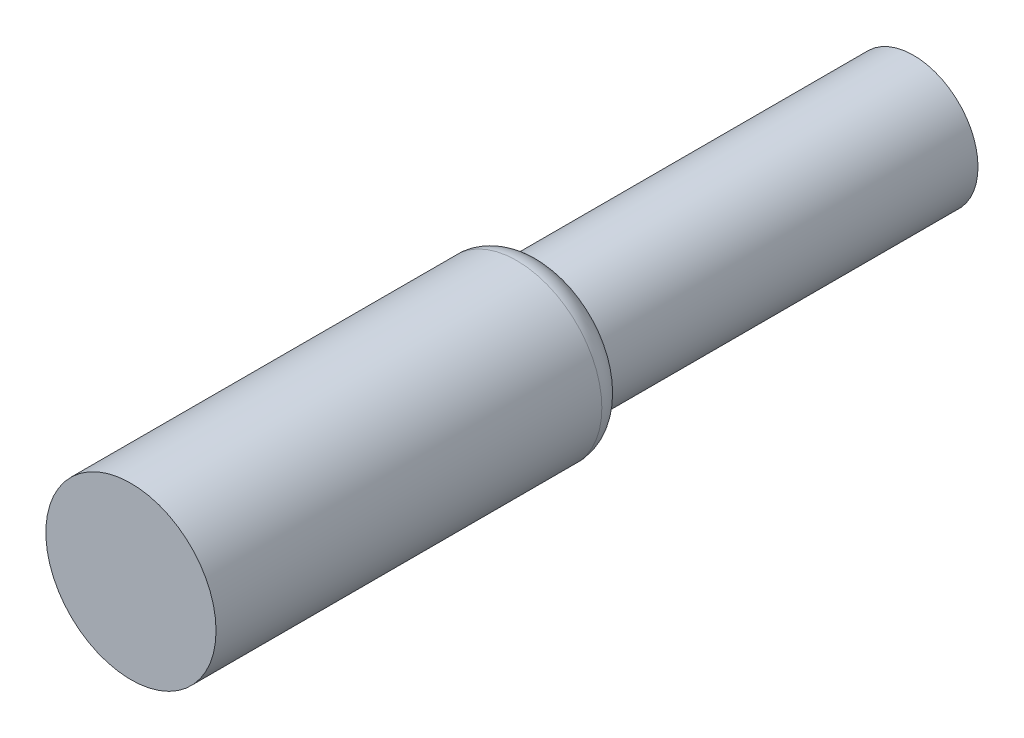
ISO-10303-21;
HEADER;
FILE_DESCRIPTION(('STEP AP214'),'2;1');
FILE_NAME('part.step','',(''),(''),'','','');
FILE_SCHEMA(('AUTOMOTIVE_DESIGN { 1 0 10303 214 1 1 1 1 }'));
ENDSEC;
DATA;
#1=APPLICATION_CONTEXT('core data for automotive mechanical design processes');
#2=APPLICATION_PROTOCOL_DEFINITION('international standard','automotive_design',2000,#1);
#3=PRODUCT_CONTEXT('',#1,'mechanical');
#4=PRODUCT('Part','Part','',(#3));
#5=PRODUCT_RELATED_PRODUCT_CATEGORY('part','',(#4));
#6=PRODUCT_DEFINITION_FORMATION('','',#4);
#7=PRODUCT_DEFINITION_CONTEXT('part definition',#1,'design');
#8=PRODUCT_DEFINITION('design','',#6,#7);
#9=PRODUCT_DEFINITION_SHAPE('','',#8);
#10=(LENGTH_UNIT() NAMED_UNIT(*) SI_UNIT(.MILLI.,.METRE.));
#11=(NAMED_UNIT(*) PLANE_ANGLE_UNIT() SI_UNIT($,.RADIAN.));
#12=(NAMED_UNIT(*) SI_UNIT($,.STERADIAN.) SOLID_ANGLE_UNIT());
#13=UNCERTAINTY_MEASURE_WITH_UNIT(LENGTH_MEASURE(1.E-05),#10,'distance_accuracy_value','');
#14=(GEOMETRIC_REPRESENTATION_CONTEXT(3) GLOBAL_UNCERTAINTY_ASSIGNED_CONTEXT((#13)) GLOBAL_UNIT_ASSIGNED_CONTEXT((#10,
#11,#12)) REPRESENTATION_CONTEXT('',''));
#15=CARTESIAN_POINT('',(0.,0.,0.));
#16=DIRECTION('',(0.,0.,1.));
#17=DIRECTION('',(1.,0.,0.));
#18=AXIS2_PLACEMENT_3D('',#15,#16,#17);
#19=CARTESIAN_POINT('',(0.,0.,0.));
#20=DIRECTION('',(0.,0.,1.));
#21=DIRECTION('',(1.,0.,0.));
#22=AXIS2_PLACEMENT_3D('',#19,#20,#21);
#23=PLANE('',#22);
#24=CARTESIAN_POINT('',(0.,0.,0.));
#25=DIRECTION('',(0.,0.,1.));
#26=DIRECTION('',(1.,0.,0.));
#27=AXIS2_PLACEMENT_3D('',#24,#25,#26);
#28=CIRCLE('',#27,3.27421875);
#29=CARTESIAN_POINT('',(3.27421875,0.,0.));
#30=VERTEX_POINT('',#29);
#31=EDGE_CURVE('E59',#30,#30,#28,.T.);
#32=ORIENTED_EDGE('',*,*,#31,.T.);
#33=EDGE_LOOP('',(#32));
#34=FACE_BOUND('',#33,.T.);
#35=ADVANCED_FACE('F41',(#34),#23,.T.);
#36=CARTESIAN_POINT('',(0.,0.,-30.1094692211863));
#37=DIRECTION('',(0.,0.,-1.));
#38=DIRECTION('',(-1.,0.,0.));
#39=AXIS2_PLACEMENT_3D('',#36,#37,#38);
#40=PLANE('',#39);
#41=CARTESIAN_POINT('',(0.,0.,-30.1094692211863));
#42=DIRECTION('',(0.,0.,1.));
#43=DIRECTION('',(1.,0.,0.));
#44=AXIS2_PLACEMENT_3D('',#41,#42,#43);
#45=CIRCLE('',#44,2.48046875);
#46=CARTESIAN_POINT('',(2.48046875,0.,-30.1094692211863));
#47=VERTEX_POINT('',#46);
#48=EDGE_CURVE('E49',#47,#47,#45,.T.);
#49=ORIENTED_EDGE('',*,*,#48,.F.);
#50=EDGE_LOOP('',(#49));
#51=FACE_BOUND('',#50,.T.);
#52=ADVANCED_FACE('F76',(#51),#40,.T.);
#53=CARTESIAN_POINT('',(0.,0.,-15.8219692211863));
#54=DIRECTION('',(0.,0.,1.));
#55=DIRECTION('',(1.,0.,0.));
#56=AXIS2_PLACEMENT_3D('',#53,#54,#55);
#57=CYLINDRICAL_SURFACE('',#56,2.48046875);
#58=ORIENTED_EDGE('',*,*,#48,.T.);
#59=EDGE_LOOP('',(#58));
#60=FACE_BOUND('',#59,.T.);
#61=CARTESIAN_POINT('',(0.,0.,-15.8219692211863));
#62=DIRECTION('',(0.,0.,1.));
#63=DIRECTION('',(1.,0.,0.));
#64=AXIS2_PLACEMENT_3D('',#61,#62,#63);
#65=CIRCLE('',#64,2.48046875);
#66=CARTESIAN_POINT('',(2.48046875,0.,-15.8219692211863));
#67=VERTEX_POINT('',#66);
#68=EDGE_CURVE('E54',#67,#67,#65,.T.);
#69=ORIENTED_EDGE('',*,*,#68,.F.);
#70=EDGE_LOOP('',(#69));
#71=FACE_BOUND('',#70,.T.);
#72=ADVANCED_FACE('F69',(#60,#71),#57,.T.);
#73=CARTESIAN_POINT('',(0.,0.,-15.8219692211863));
#74=DIRECTION('',(0.,0.,1.));
#75=DIRECTION('',(1.,0.,0.));
#76=AXIS2_PLACEMENT_3D('',#73,#74,#75);
#77=CYLINDRICAL_SURFACE('',#76,3.27421875);
#78=CARTESIAN_POINT('',(0.,0.,-14.843469891856));
#79=DIRECTION('',(0.,0.,-1.));
#80=DIRECTION('',(-1.,0.,0.));
#81=AXIS2_PLACEMENT_3D('',#78,#79,#80);
#82=CIRCLE('',#81,3.27421875);
#83=CARTESIAN_POINT('',(-3.27421875,0.,-14.843469891856));
#84=VERTEX_POINT('',#83);
#85=EDGE_CURVE('E10',#84,#84,#82,.F.);
#86=ORIENTED_EDGE('',*,*,#85,.T.);
#87=EDGE_LOOP('',(#86));
#88=FACE_BOUND('',#87,.T.);
#89=ORIENTED_EDGE('',*,*,#31,.F.);
#90=EDGE_LOOP('',(#89));
#91=FACE_BOUND('',#90,.T.);
#92=ADVANCED_FACE('F67',(#88,#91),#77,.T.);
#93=CARTESIAN_POINT('',(0.,0.,-14.843469891856));
#94=DIRECTION('',(0.,0.,-1.));
#95=DIRECTION('',(-1.,0.,0.));
#96=AXIS2_PLACEMENT_3D('',#93,#94,#95);
#97=TOROIDAL_SURFACE('',#96,2.27421875,1.);
#98=ORIENTED_EDGE('',*,*,#68,.T.);
#99=EDGE_LOOP('',(#98));
#100=FACE_BOUND('',#99,.T.);
#101=ORIENTED_EDGE('',*,*,#85,.F.);
#102=EDGE_LOOP('',(#101));
#103=FACE_BOUND('',#102,.T.);
#104=ADVANCED_FACE('F43',(#100,#103),#97,.T.);
#105=CLOSED_SHELL('',(#35,#52,#72,#92,#104));
#106=MANIFOLD_SOLID_BREP('B2',#105);
#107=ADVANCED_BREP_SHAPE_REPRESENTATION('',(#18,#106),#14);
#108=SHAPE_DEFINITION_REPRESENTATION(#9,#107);
ENDSEC;
END-ISO-10303-21;
